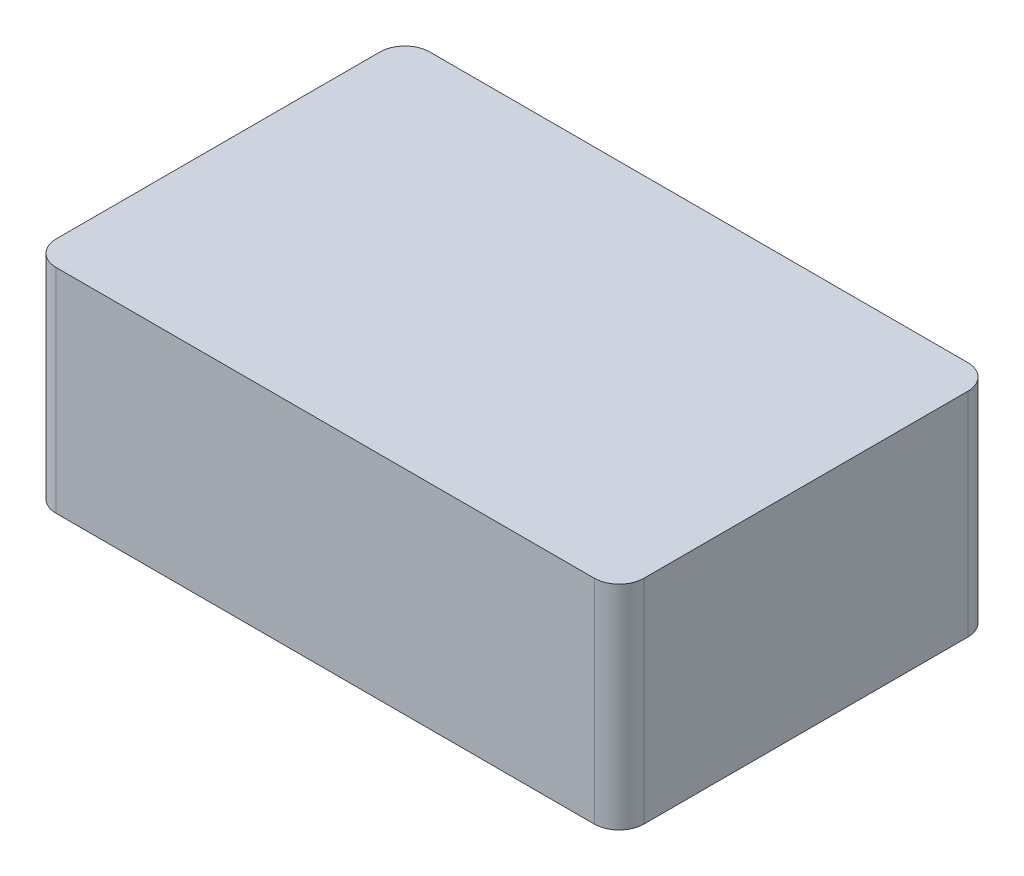
ISO-10303-21;
HEADER;
FILE_DESCRIPTION(('STEP AP214'),'2;1');
FILE_NAME('part.step','',(''),(''),'','','');
FILE_SCHEMA(('AUTOMOTIVE_DESIGN { 1 0 10303 214 1 1 1 1 }'));
ENDSEC;
DATA;
#1=APPLICATION_CONTEXT('core data for automotive mechanical design processes');
#2=APPLICATION_PROTOCOL_DEFINITION('international standard','automotive_design',2000,#1);
#3=PRODUCT_CONTEXT('',#1,'mechanical');
#4=PRODUCT('Part','Part','',(#3));
#5=PRODUCT_RELATED_PRODUCT_CATEGORY('part','',(#4));
#6=PRODUCT_DEFINITION_FORMATION('','',#4);
#7=PRODUCT_DEFINITION_CONTEXT('part definition',#1,'design');
#8=PRODUCT_DEFINITION('design','',#6,#7);
#9=PRODUCT_DEFINITION_SHAPE('','',#8);
#10=(LENGTH_UNIT() NAMED_UNIT(*) SI_UNIT(.MILLI.,.METRE.));
#11=(NAMED_UNIT(*) PLANE_ANGLE_UNIT() SI_UNIT($,.RADIAN.));
#12=(NAMED_UNIT(*) SI_UNIT($,.STERADIAN.) SOLID_ANGLE_UNIT());
#13=UNCERTAINTY_MEASURE_WITH_UNIT(LENGTH_MEASURE(1.E-05),#10,'distance_accuracy_value','');
#14=(GEOMETRIC_REPRESENTATION_CONTEXT(3) GLOBAL_UNCERTAINTY_ASSIGNED_CONTEXT((#13)) GLOBAL_UNIT_ASSIGNED_CONTEXT((#10,
#11,#12)) REPRESENTATION_CONTEXT('',''));
#15=CARTESIAN_POINT('',(0.,0.,0.));
#16=DIRECTION('',(0.,0.,1.));
#17=DIRECTION('',(1.,0.,0.));
#18=AXIS2_PLACEMENT_3D('',#15,#16,#17);
#19=CARTESIAN_POINT('',(43.75,31.7,-27.8));
#20=DIRECTION('',(-1.,0.,0.));
#21=DIRECTION('',(0.,0.,1.));
#22=AXIS2_PLACEMENT_3D('',#19,#20,#21);
#23=PLANE('',#22);
#24=DIRECTION('',(0.,0.,-1.));
#25=VECTOR('',#24,1.);
#26=CARTESIAN_POINT('',(43.75,31.7,-27.8));
#27=LINE('',#26,#25);
#28=CARTESIAN_POINT('',(43.75,31.7,24.1));
#29=VERTEX_POINT('',#28);
#30=CARTESIAN_POINT('',(43.75,31.7,-24.1));
#31=VERTEX_POINT('',#30);
#32=EDGE_CURVE('E125',#29,#31,#27,.T.);
#33=ORIENTED_EDGE('',*,*,#32,.F.);
#34=DIRECTION('',(0.,-1.,0.));
#35=VECTOR('',#34,1.);
#36=CARTESIAN_POINT('',(43.75,31.7,24.1));
#37=LINE('',#36,#35);
#38=CARTESIAN_POINT('',(43.75,0.,24.1));
#39=VERTEX_POINT('',#38);
#40=EDGE_CURVE('E109',#29,#39,#37,.T.);
#41=ORIENTED_EDGE('',*,*,#40,.T.);
#42=DIRECTION('',(0.,0.,-1.));
#43=VECTOR('',#42,1.);
#44=CARTESIAN_POINT('',(43.75,0.,-27.8));
#45=LINE('',#44,#43);
#46=CARTESIAN_POINT('',(43.75,0.,-24.1));
#47=VERTEX_POINT('',#46);
#48=EDGE_CURVE('E123',#39,#47,#45,.T.);
#49=ORIENTED_EDGE('',*,*,#48,.T.);
#50=DIRECTION('',(0.,-1.,0.));
#51=VECTOR('',#50,1.);
#52=CARTESIAN_POINT('',(43.75,31.7,-24.1));
#53=LINE('',#52,#51);
#54=EDGE_CURVE('E128',#47,#31,#53,.F.);
#55=ORIENTED_EDGE('',*,*,#54,.T.);
#56=EDGE_LOOP('',(#33,#41,#49,#55));
#57=FACE_BOUND('',#56,.T.);
#58=ADVANCED_FACE('F39',(#57),#23,.F.);
#59=CARTESIAN_POINT('',(-43.75,31.7,-27.8));
#60=DIRECTION('',(0.,0.,1.));
#61=DIRECTION('',(1.,0.,0.));
#62=AXIS2_PLACEMENT_3D('',#59,#60,#61);
#63=PLANE('',#62);
#64=DIRECTION('',(-1.,0.,0.));
#65=VECTOR('',#64,1.);
#66=CARTESIAN_POINT('',(-43.75,31.7,-27.8));
#67=LINE('',#66,#65);
#68=CARTESIAN_POINT('',(40.05,31.7,-27.8));
#69=VERTEX_POINT('',#68);
#70=CARTESIAN_POINT('',(-40.05,31.7,-27.8));
#71=VERTEX_POINT('',#70);
#72=EDGE_CURVE('E168',#69,#71,#67,.T.);
#73=ORIENTED_EDGE('',*,*,#72,.F.);
#74=DIRECTION('',(0.,-1.,0.));
#75=VECTOR('',#74,1.);
#76=CARTESIAN_POINT('',(40.05,31.7,-27.8));
#77=LINE('',#76,#75);
#78=CARTESIAN_POINT('',(40.05,0.,-27.8));
#79=VERTEX_POINT('',#78);
#80=EDGE_CURVE('E159',#69,#79,#77,.T.);
#81=ORIENTED_EDGE('',*,*,#80,.T.);
#82=DIRECTION('',(-1.,0.,0.));
#83=VECTOR('',#82,1.);
#84=CARTESIAN_POINT('',(-43.75,0.,-27.8));
#85=LINE('',#84,#83);
#86=CARTESIAN_POINT('',(-40.05,0.,-27.8));
#87=VERTEX_POINT('',#86);
#88=EDGE_CURVE('E127',#79,#87,#85,.T.);
#89=ORIENTED_EDGE('',*,*,#88,.T.);
#90=DIRECTION('',(0.,-1.,0.));
#91=VECTOR('',#90,1.);
#92=CARTESIAN_POINT('',(-40.05,31.7,-27.8));
#93=LINE('',#92,#91);
#94=EDGE_CURVE('E160',#87,#71,#93,.F.);
#95=ORIENTED_EDGE('',*,*,#94,.T.);
#96=EDGE_LOOP('',(#73,#81,#89,#95));
#97=FACE_BOUND('',#96,.T.);
#98=ADVANCED_FACE('F164',(#97),#63,.F.);
#99=CARTESIAN_POINT('',(-43.75,31.7,-27.8));
#100=DIRECTION('',(1.,0.,0.));
#101=DIRECTION('',(0.,0.,-1.));
#102=AXIS2_PLACEMENT_3D('',#99,#100,#101);
#103=PLANE('',#102);
#104=DIRECTION('',(0.,0.,1.));
#105=VECTOR('',#104,1.);
#106=CARTESIAN_POINT('',(-43.75,31.7,-27.8));
#107=LINE('',#106,#105);
#108=CARTESIAN_POINT('',(-43.75,31.7,-24.1));
#109=VERTEX_POINT('',#108);
#110=CARTESIAN_POINT('',(-43.75,31.7,24.1));
#111=VERTEX_POINT('',#110);
#112=EDGE_CURVE('E174',#109,#111,#107,.T.);
#113=ORIENTED_EDGE('',*,*,#112,.F.);
#114=DIRECTION('',(0.,-1.,0.));
#115=VECTOR('',#114,1.);
#116=CARTESIAN_POINT('',(-43.75,31.7,-24.1));
#117=LINE('',#116,#115);
#118=CARTESIAN_POINT('',(-43.75,0.,-24.1));
#119=VERTEX_POINT('',#118);
#120=EDGE_CURVE('E11',#109,#119,#117,.T.);
#121=ORIENTED_EDGE('',*,*,#120,.T.);
#122=DIRECTION('',(0.,0.,1.));
#123=VECTOR('',#122,1.);
#124=CARTESIAN_POINT('',(-43.75,0.,-27.8));
#125=LINE('',#124,#123);
#126=CARTESIAN_POINT('',(-43.75,0.,24.1));
#127=VERTEX_POINT('',#126);
#128=EDGE_CURVE('E133',#119,#127,#125,.T.);
#129=ORIENTED_EDGE('',*,*,#128,.T.);
#130=DIRECTION('',(0.,-1.,0.));
#131=VECTOR('',#130,1.);
#132=CARTESIAN_POINT('',(-43.75,31.7,24.1));
#133=LINE('',#132,#131);
#134=EDGE_CURVE('E50',#127,#111,#133,.F.);
#135=ORIENTED_EDGE('',*,*,#134,.T.);
#136=EDGE_LOOP('',(#113,#121,#129,#135));
#137=FACE_BOUND('',#136,.T.);
#138=ADVANCED_FACE('F171',(#137),#103,.F.);
#139=CARTESIAN_POINT('',(-43.75,31.7,27.8));
#140=DIRECTION('',(0.,0.,-1.));
#141=DIRECTION('',(-1.,0.,0.));
#142=AXIS2_PLACEMENT_3D('',#139,#140,#141);
#143=PLANE('',#142);
#144=DIRECTION('',(1.,0.,0.));
#145=VECTOR('',#144,1.);
#146=CARTESIAN_POINT('',(-43.75,0.,27.8));
#147=LINE('',#146,#145);
#148=CARTESIAN_POINT('',(-40.05,0.,27.8));
#149=VERTEX_POINT('',#148);
#150=CARTESIAN_POINT('',(40.05,0.,27.8));
#151=VERTEX_POINT('',#150);
#152=EDGE_CURVE('E139',#149,#151,#147,.T.);
#153=ORIENTED_EDGE('',*,*,#152,.T.);
#154=DIRECTION('',(0.,-1.,0.));
#155=VECTOR('',#154,1.);
#156=CARTESIAN_POINT('',(40.05,31.7,27.8));
#157=LINE('',#156,#155);
#158=CARTESIAN_POINT('',(40.05,31.7,27.8));
#159=VERTEX_POINT('',#158);
#160=EDGE_CURVE('E106',#151,#159,#157,.F.);
#161=ORIENTED_EDGE('',*,*,#160,.T.);
#162=DIRECTION('',(1.,0.,0.));
#163=VECTOR('',#162,1.);
#164=CARTESIAN_POINT('',(-43.75,31.7,27.8));
#165=LINE('',#164,#163);
#166=CARTESIAN_POINT('',(-40.05,31.7,27.8));
#167=VERTEX_POINT('',#166);
#168=EDGE_CURVE('E136',#167,#159,#165,.T.);
#169=ORIENTED_EDGE('',*,*,#168,.F.);
#170=DIRECTION('',(0.,-1.,0.));
#171=VECTOR('',#170,1.);
#172=CARTESIAN_POINT('',(-40.05,31.7,27.8));
#173=LINE('',#172,#171);
#174=EDGE_CURVE('E113',#167,#149,#173,.T.);
#175=ORIENTED_EDGE('',*,*,#174,.T.);
#176=EDGE_LOOP('',(#153,#161,#169,#175));
#177=FACE_BOUND('',#176,.T.);
#178=ADVANCED_FACE('F200',(#177),#143,.F.);
#179=CARTESIAN_POINT('',(0.,31.7,0.));
#180=DIRECTION('',(0.,1.,0.));
#181=DIRECTION('',(0.,0.,1.));
#182=AXIS2_PLACEMENT_3D('',#179,#180,#181);
#183=PLANE('',#182);
#184=ORIENTED_EDGE('',*,*,#168,.T.);
#185=CARTESIAN_POINT('',(40.05,31.7,24.1));
#186=DIRECTION('',(0.,1.,0.));
#187=DIRECTION('',(0.,0.,1.));
#188=AXIS2_PLACEMENT_3D('',#185,#186,#187);
#189=CIRCLE('',#188,3.7);
#190=EDGE_CURVE('E151',#159,#29,#189,.T.);
#191=ORIENTED_EDGE('',*,*,#190,.T.);
#192=ORIENTED_EDGE('',*,*,#32,.T.);
#193=CARTESIAN_POINT('',(40.05,31.7,-24.1));
#194=DIRECTION('',(0.,1.,0.));
#195=DIRECTION('',(0.,0.,1.));
#196=AXIS2_PLACEMENT_3D('',#193,#194,#195);
#197=CIRCLE('',#196,3.7);
#198=EDGE_CURVE('E153',#31,#69,#197,.T.);
#199=ORIENTED_EDGE('',*,*,#198,.T.);
#200=ORIENTED_EDGE('',*,*,#72,.T.);
#201=CARTESIAN_POINT('',(-40.05,31.7,-24.1));
#202=DIRECTION('',(0.,1.,0.));
#203=DIRECTION('',(0.,0.,1.));
#204=AXIS2_PLACEMENT_3D('',#201,#202,#203);
#205=CIRCLE('',#204,3.7);
#206=EDGE_CURVE('E58',#71,#109,#205,.T.);
#207=ORIENTED_EDGE('',*,*,#206,.T.);
#208=ORIENTED_EDGE('',*,*,#112,.T.);
#209=CARTESIAN_POINT('',(-40.05,31.7,24.1));
#210=DIRECTION('',(0.,1.,0.));
#211=DIRECTION('',(0.,0.,1.));
#212=AXIS2_PLACEMENT_3D('',#209,#210,#211);
#213=CIRCLE('',#212,3.7);
#214=EDGE_CURVE('E148',#111,#167,#213,.T.);
#215=ORIENTED_EDGE('',*,*,#214,.T.);
#216=EDGE_LOOP('',(#184,#191,#192,#199,#200,#207,#208,#215));
#217=FACE_BOUND('',#216,.T.);
#218=ADVANCED_FACE('F177',(#217),#183,.T.);
#219=CARTESIAN_POINT('',(0.,0.,0.));
#220=DIRECTION('',(0.,1.,0.));
#221=DIRECTION('',(0.,0.,1.));
#222=AXIS2_PLACEMENT_3D('',#219,#220,#221);
#223=PLANE('',#222);
#224=ORIENTED_EDGE('',*,*,#48,.F.);
#225=CARTESIAN_POINT('',(40.05,0.,24.1));
#226=DIRECTION('',(0.,1.,0.));
#227=DIRECTION('',(0.,0.,1.));
#228=AXIS2_PLACEMENT_3D('',#225,#226,#227);
#229=CIRCLE('',#228,3.7);
#230=EDGE_CURVE('E103',#39,#151,#229,.F.);
#231=ORIENTED_EDGE('',*,*,#230,.T.);
#232=ORIENTED_EDGE('',*,*,#152,.F.);
#233=CARTESIAN_POINT('',(-40.05,0.,24.1));
#234=DIRECTION('',(0.,1.,0.));
#235=DIRECTION('',(0.,0.,1.));
#236=AXIS2_PLACEMENT_3D('',#233,#234,#235);
#237=CIRCLE('',#236,3.7);
#238=EDGE_CURVE('E124',#149,#127,#237,.F.);
#239=ORIENTED_EDGE('',*,*,#238,.T.);
#240=ORIENTED_EDGE('',*,*,#128,.F.);
#241=CARTESIAN_POINT('',(-40.05,0.,-24.1));
#242=DIRECTION('',(0.,1.,0.));
#243=DIRECTION('',(0.,0.,1.));
#244=AXIS2_PLACEMENT_3D('',#241,#242,#243);
#245=CIRCLE('',#244,3.7);
#246=EDGE_CURVE('E143',#119,#87,#245,.F.);
#247=ORIENTED_EDGE('',*,*,#246,.T.);
#248=ORIENTED_EDGE('',*,*,#88,.F.);
#249=CARTESIAN_POINT('',(40.05,0.,-24.1));
#250=DIRECTION('',(0.,1.,0.));
#251=DIRECTION('',(0.,0.,1.));
#252=AXIS2_PLACEMENT_3D('',#249,#250,#251);
#253=CIRCLE('',#252,3.7);
#254=EDGE_CURVE('E117',#79,#47,#253,.F.);
#255=ORIENTED_EDGE('',*,*,#254,.T.);
#256=EDGE_LOOP('',(#224,#231,#232,#239,#240,#247,#248,#255));
#257=FACE_BOUND('',#256,.T.);
#258=ADVANCED_FACE('F126',(#257),#223,.F.);
#259=CARTESIAN_POINT('',(40.05,31.7,24.1));
#260=DIRECTION('',(0.,-1.,0.));
#261=DIRECTION('',(0.,0.,-1.));
#262=AXIS2_PLACEMENT_3D('',#259,#260,#261);
#263=CYLINDRICAL_SURFACE('',#262,3.7);
#264=ORIENTED_EDGE('',*,*,#190,.F.);
#265=ORIENTED_EDGE('',*,*,#160,.F.);
#266=ORIENTED_EDGE('',*,*,#230,.F.);
#267=ORIENTED_EDGE('',*,*,#40,.F.);
#268=EDGE_LOOP('',(#264,#265,#266,#267));
#269=FACE_BOUND('',#268,.T.);
#270=ADVANCED_FACE('F108',(#269),#263,.T.);
#271=CARTESIAN_POINT('',(40.05,31.7,-24.1));
#272=DIRECTION('',(0.,-1.,0.));
#273=DIRECTION('',(0.,0.,-1.));
#274=AXIS2_PLACEMENT_3D('',#271,#272,#273);
#275=CYLINDRICAL_SURFACE('',#274,3.7);
#276=ORIENTED_EDGE('',*,*,#198,.F.);
#277=ORIENTED_EDGE('',*,*,#54,.F.);
#278=ORIENTED_EDGE('',*,*,#254,.F.);
#279=ORIENTED_EDGE('',*,*,#80,.F.);
#280=EDGE_LOOP('',(#276,#277,#278,#279));
#281=FACE_BOUND('',#280,.T.);
#282=ADVANCED_FACE('F179',(#281),#275,.T.);
#283=CARTESIAN_POINT('',(-40.05,31.7,-24.1));
#284=DIRECTION('',(0.,-1.,0.));
#285=DIRECTION('',(0.,0.,-1.));
#286=AXIS2_PLACEMENT_3D('',#283,#284,#285);
#287=CYLINDRICAL_SURFACE('',#286,3.7);
#288=ORIENTED_EDGE('',*,*,#206,.F.);
#289=ORIENTED_EDGE('',*,*,#94,.F.);
#290=ORIENTED_EDGE('',*,*,#246,.F.);
#291=ORIENTED_EDGE('',*,*,#120,.F.);
#292=EDGE_LOOP('',(#288,#289,#290,#291));
#293=FACE_BOUND('',#292,.T.);
#294=ADVANCED_FACE('F175',(#293),#287,.T.);
#295=CARTESIAN_POINT('',(-40.05,31.7,24.1));
#296=DIRECTION('',(0.,-1.,0.));
#297=DIRECTION('',(0.,0.,-1.));
#298=AXIS2_PLACEMENT_3D('',#295,#296,#297);
#299=CYLINDRICAL_SURFACE('',#298,3.7);
#300=ORIENTED_EDGE('',*,*,#214,.F.);
#301=ORIENTED_EDGE('',*,*,#134,.F.);
#302=ORIENTED_EDGE('',*,*,#238,.F.);
#303=ORIENTED_EDGE('',*,*,#174,.F.);
#304=EDGE_LOOP('',(#300,#301,#302,#303));
#305=FACE_BOUND('',#304,.T.);
#306=ADVANCED_FACE('F41',(#305),#299,.T.);
#307=CLOSED_SHELL('',(#58,#98,#138,#178,#218,#258,#270,#282,#294,#306));
#308=MANIFOLD_SOLID_BREP('B2',#307);
#309=ADVANCED_BREP_SHAPE_REPRESENTATION('',(#18,#308),#14);
#310=SHAPE_DEFINITION_REPRESENTATION(#9,#309);
ENDSEC;
END-ISO-10303-21;
